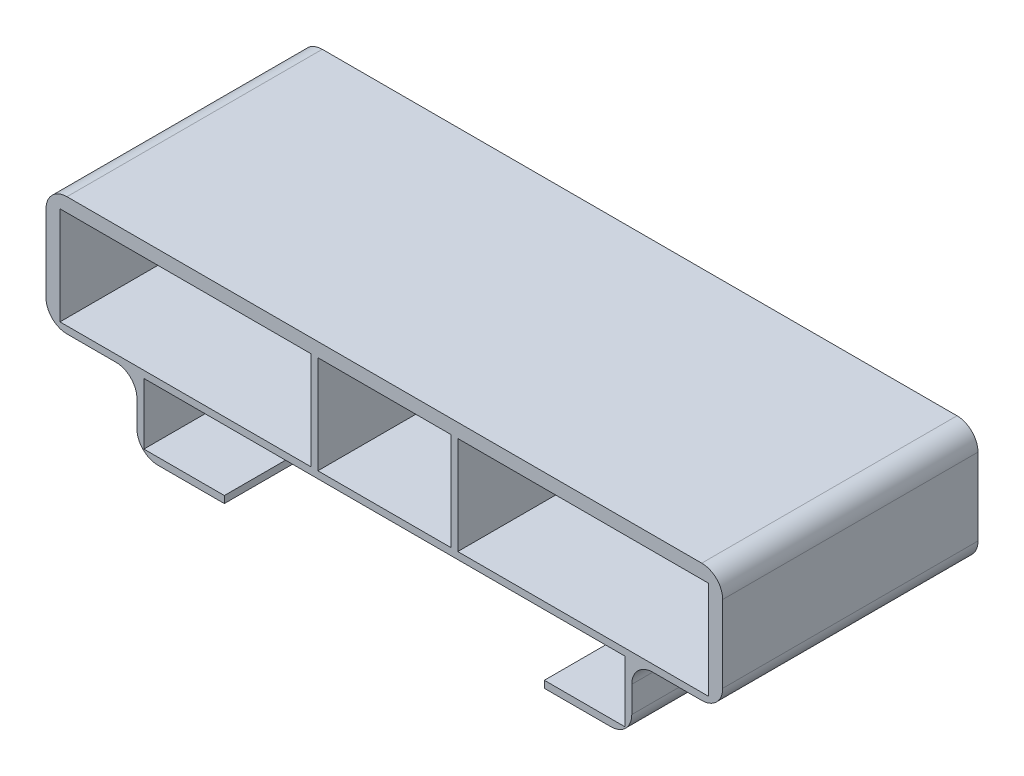
ISO-10303-21;
HEADER;
FILE_DESCRIPTION(('STEP AP214'),'2;1');
FILE_NAME('part.step','',(''),(''),'','','');
FILE_SCHEMA(('AUTOMOTIVE_DESIGN { 1 0 10303 214 1 1 1 1 }'));
ENDSEC;
DATA;
#1=APPLICATION_CONTEXT('core data for automotive mechanical design processes');
#2=APPLICATION_PROTOCOL_DEFINITION('international standard','automotive_design',2000,#1);
#3=PRODUCT_CONTEXT('',#1,'mechanical');
#4=PRODUCT('Part','Part','',(#3));
#5=PRODUCT_RELATED_PRODUCT_CATEGORY('part','',(#4));
#6=PRODUCT_DEFINITION_FORMATION('','',#4);
#7=PRODUCT_DEFINITION_CONTEXT('part definition',#1,'design');
#8=PRODUCT_DEFINITION('design','',#6,#7);
#9=PRODUCT_DEFINITION_SHAPE('','',#8);
#10=(LENGTH_UNIT() NAMED_UNIT(*) SI_UNIT(.MILLI.,.METRE.));
#11=(NAMED_UNIT(*) PLANE_ANGLE_UNIT() SI_UNIT($,.RADIAN.));
#12=(NAMED_UNIT(*) SI_UNIT($,.STERADIAN.) SOLID_ANGLE_UNIT());
#13=UNCERTAINTY_MEASURE_WITH_UNIT(LENGTH_MEASURE(1.E-05),#10,'distance_accuracy_value','');
#14=(GEOMETRIC_REPRESENTATION_CONTEXT(3) GLOBAL_UNCERTAINTY_ASSIGNED_CONTEXT((#13)) GLOBAL_UNIT_ASSIGNED_CONTEXT((#10,
#11,#12)) REPRESENTATION_CONTEXT('',''));
#15=CARTESIAN_POINT('',(0.,0.,0.));
#16=DIRECTION('',(0.,0.,1.));
#17=DIRECTION('',(1.,0.,0.));
#18=AXIS2_PLACEMENT_3D('',#15,#16,#17);
#19=CARTESIAN_POINT('',(0.,0.,73.));
#20=DIRECTION('',(0.,-1.,0.));
#21=DIRECTION('',(0.,0.,-1.));
#22=AXIS2_PLACEMENT_3D('',#19,#20,#21);
#23=PLANE('',#22);
#24=DIRECTION('',(1.,0.,0.));
#25=VECTOR('',#24,1.);
#26=CARTESIAN_POINT('',(51.75,0.,2.));
#27=LINE('',#26,#25);
#28=CARTESIAN_POINT('',(51.75,0.,2.));
#29=VERTEX_POINT('',#28);
#30=CARTESIAN_POINT('',(89.75,0.,2.));
#31=VERTEX_POINT('',#30);
#32=EDGE_CURVE('E309',#29,#31,#27,.T.);
#33=ORIENTED_EDGE('',*,*,#32,.F.);
#34=DIRECTION('',(0.,0.,-1.));
#35=VECTOR('',#34,1.);
#36=CARTESIAN_POINT('',(51.75,0.,0.));
#37=LINE('',#36,#35);
#38=CARTESIAN_POINT('',(51.75,0.,73.));
#39=VERTEX_POINT('',#38);
#40=EDGE_CURVE('E337',#39,#29,#37,.T.);
#41=ORIENTED_EDGE('',*,*,#40,.F.);
#42=DIRECTION('',(-1.,0.,0.));
#43=VECTOR('',#42,1.);
#44=CARTESIAN_POINT('',(0.,0.,73.));
#45=LINE('',#44,#43);
#46=CARTESIAN_POINT('',(89.75,0.,73.));
#47=VERTEX_POINT('',#46);
#48=EDGE_CURVE('E542',#47,#39,#45,.T.);
#49=ORIENTED_EDGE('',*,*,#48,.F.);
#50=DIRECTION('',(0.,0.,1.));
#51=VECTOR('',#50,1.);
#52=CARTESIAN_POINT('',(89.75,0.,0.));
#53=LINE('',#52,#51);
#54=EDGE_CURVE('E326',#31,#47,#53,.T.);
#55=ORIENTED_EDGE('',*,*,#54,.F.);
#56=EDGE_LOOP('',(#33,#41,#49,#55));
#57=FACE_BOUND('',#56,.T.);
#58=ADVANCED_FACE('F44',(#57),#23,.F.);
#59=CARTESIAN_POINT('',(0.,28.,0.));
#60=DIRECTION('',(0.,1.,0.));
#61=DIRECTION('',(0.,0.,1.));
#62=AXIS2_PLACEMENT_3D('',#59,#60,#61);
#63=PLANE('',#62);
#64=DIRECTION('',(1.,0.,0.));
#65=VECTOR('',#64,1.);
#66=CARTESIAN_POINT('',(51.75,28.,2.));
#67=LINE('',#66,#65);
#68=CARTESIAN_POINT('',(51.75,28.,2.));
#69=VERTEX_POINT('',#68);
#70=CARTESIAN_POINT('',(89.75,28.,2.));
#71=VERTEX_POINT('',#70);
#72=EDGE_CURVE('E300',#69,#71,#67,.T.);
#73=ORIENTED_EDGE('',*,*,#72,.T.);
#74=DIRECTION('',(0.,0.,1.));
#75=VECTOR('',#74,1.);
#76=CARTESIAN_POINT('',(89.75,28.,0.));
#77=LINE('',#76,#75);
#78=CARTESIAN_POINT('',(89.75,28.,73.));
#79=VERTEX_POINT('',#78);
#80=EDGE_CURVE('E283',#71,#79,#77,.T.);
#81=ORIENTED_EDGE('',*,*,#80,.T.);
#82=DIRECTION('',(1.,0.,0.));
#83=VECTOR('',#82,1.);
#84=CARTESIAN_POINT('',(-26.,28.,73.));
#85=LINE('',#84,#83);
#86=CARTESIAN_POINT('',(51.75,28.,73.));
#87=VERTEX_POINT('',#86);
#88=EDGE_CURVE('E378',#87,#79,#85,.T.);
#89=ORIENTED_EDGE('',*,*,#88,.F.);
#90=DIRECTION('',(0.,0.,-1.));
#91=VECTOR('',#90,1.);
#92=CARTESIAN_POINT('',(51.75,28.,0.));
#93=LINE('',#92,#91);
#94=EDGE_CURVE('E302',#87,#69,#93,.T.);
#95=ORIENTED_EDGE('',*,*,#94,.T.);
#96=EDGE_LOOP('',(#73,#81,#89,#95));
#97=FACE_BOUND('',#96,.T.);
#98=ADVANCED_FACE('F301',(#97),#63,.F.);
#99=CARTESIAN_POINT('',(51.75,101.027392121039,0.));
#100=DIRECTION('',(-1.,0.,0.));
#101=DIRECTION('',(0.,0.,1.));
#102=AXIS2_PLACEMENT_3D('',#99,#100,#101);
#103=PLANE('',#102);
#104=DIRECTION('',(0.,-1.,0.));
#105=VECTOR('',#104,1.);
#106=CARTESIAN_POINT('',(51.75,66.0525951808809,2.));
#107=LINE('',#106,#105);
#108=EDGE_CURVE('E313',#69,#29,#107,.T.);
#109=ORIENTED_EDGE('',*,*,#108,.F.);
#110=ORIENTED_EDGE('',*,*,#94,.F.);
#111=DIRECTION('',(0.,-1.,0.));
#112=VECTOR('',#111,1.);
#113=CARTESIAN_POINT('',(51.75,101.027392121039,73.));
#114=LINE('',#113,#112);
#115=EDGE_CURVE('E342',#87,#39,#114,.T.);
#116=ORIENTED_EDGE('',*,*,#115,.T.);
#117=ORIENTED_EDGE('',*,*,#40,.T.);
#118=EDGE_LOOP('',(#109,#110,#116,#117));
#119=FACE_BOUND('',#118,.T.);
#120=ADVANCED_FACE('F789',(#119),#103,.F.);
#121=CARTESIAN_POINT('',(89.75,101.027392121039,0.));
#122=DIRECTION('',(1.,0.,0.));
#123=DIRECTION('',(0.,0.,-1.));
#124=AXIS2_PLACEMENT_3D('',#121,#122,#123);
#125=PLANE('',#124);
#126=DIRECTION('',(0.,-1.,0.));
#127=VECTOR('',#126,1.);
#128=CARTESIAN_POINT('',(89.75,66.0525951808809,2.));
#129=LINE('',#128,#127);
#130=EDGE_CURVE('E287',#71,#31,#129,.T.);
#131=ORIENTED_EDGE('',*,*,#130,.T.);
#132=ORIENTED_EDGE('',*,*,#54,.T.);
#133=DIRECTION('',(0.,-1.,0.));
#134=VECTOR('',#133,1.);
#135=CARTESIAN_POINT('',(89.75,101.027392121039,73.));
#136=LINE('',#135,#134);
#137=EDGE_CURVE('E290',#79,#47,#136,.T.);
#138=ORIENTED_EDGE('',*,*,#137,.F.);
#139=ORIENTED_EDGE('',*,*,#80,.F.);
#140=EDGE_LOOP('',(#131,#132,#138,#139));
#141=FACE_BOUND('',#140,.T.);
#142=ADVANCED_FACE('F285',(#141),#125,.F.);
#143=DIRECTION('',(0.,0.,-1.));
#144=VECTOR('',#143,1.);
#145=CARTESIAN_POINT('',(91.75,0.,0.));
#146=LINE('',#145,#144);
#147=CARTESIAN_POINT('',(91.75,0.,73.));
#148=VERTEX_POINT('',#147);
#149=CARTESIAN_POINT('',(91.75,0.,0.));
#150=VERTEX_POINT('',#149);
#151=EDGE_CURVE('E320',#148,#150,#146,.T.);
#152=ORIENTED_EDGE('',*,*,#151,.F.);
#153=CARTESIAN_POINT('',(163.5,0.,73.));
#154=VERTEX_POINT('',#153);
#155=EDGE_CURVE('E537',#154,#148,#45,.T.);
#156=ORIENTED_EDGE('',*,*,#155,.F.);
#157=DIRECTION('',(0.,0.,1.));
#158=VECTOR('',#157,1.);
#159=CARTESIAN_POINT('',(163.5,0.,0.));
#160=LINE('',#159,#158);
#161=CARTESIAN_POINT('',(163.5,0.,0.));
#162=VERTEX_POINT('',#161);
#163=EDGE_CURVE('E394',#162,#154,#160,.T.);
#164=ORIENTED_EDGE('',*,*,#163,.F.);
#165=DIRECTION('',(-1.,0.,0.));
#166=VECTOR('',#165,1.);
#167=CARTESIAN_POINT('',(0.,0.,0.));
#168=LINE('',#167,#166);
#169=EDGE_CURVE('E529',#162,#150,#168,.T.);
#170=ORIENTED_EDGE('',*,*,#169,.T.);
#171=EDGE_LOOP('',(#152,#156,#164,#170));
#172=FACE_BOUND('',#171,.T.);
#173=ADVANCED_FACE('F767',(#172),#23,.F.);
#174=DIRECTION('',(0.,0.,-1.));
#175=VECTOR('',#174,1.);
#176=CARTESIAN_POINT('',(91.75,28.,0.));
#177=LINE('',#176,#175);
#178=CARTESIAN_POINT('',(91.75,28.,73.));
#179=VERTEX_POINT('',#178);
#180=CARTESIAN_POINT('',(91.75,28.,0.));
#181=VERTEX_POINT('',#180);
#182=EDGE_CURVE('E296',#179,#181,#177,.T.);
#183=ORIENTED_EDGE('',*,*,#182,.T.);
#184=DIRECTION('',(-1.,0.,0.));
#185=VECTOR('',#184,1.);
#186=CARTESIAN_POINT('',(-26.,28.,0.));
#187=LINE('',#186,#185);
#188=CARTESIAN_POINT('',(163.5,28.,0.));
#189=VERTEX_POINT('',#188);
#190=EDGE_CURVE('E368',#189,#181,#187,.T.);
#191=ORIENTED_EDGE('',*,*,#190,.F.);
#192=DIRECTION('',(0.,0.,1.));
#193=VECTOR('',#192,1.);
#194=CARTESIAN_POINT('',(163.5,28.,0.));
#195=LINE('',#194,#193);
#196=CARTESIAN_POINT('',(163.5,28.,73.));
#197=VERTEX_POINT('',#196);
#198=EDGE_CURVE('E398',#189,#197,#195,.T.);
#199=ORIENTED_EDGE('',*,*,#198,.T.);
#200=EDGE_CURVE('E350',#179,#197,#85,.T.);
#201=ORIENTED_EDGE('',*,*,#200,.F.);
#202=EDGE_LOOP('',(#183,#191,#199,#201));
#203=FACE_BOUND('',#202,.T.);
#204=ADVANCED_FACE('F763',(#203),#63,.F.);
#205=DIRECTION('',(0.,0.,1.));
#206=VECTOR('',#205,1.);
#207=CARTESIAN_POINT('',(49.75,0.,0.));
#208=LINE('',#207,#206);
#209=CARTESIAN_POINT('',(49.75,0.,0.));
#210=VERTEX_POINT('',#209);
#211=CARTESIAN_POINT('',(49.75,0.,73.));
#212=VERTEX_POINT('',#211);
#213=EDGE_CURVE('E343',#210,#212,#208,.T.);
#214=ORIENTED_EDGE('',*,*,#213,.F.);
#215=CARTESIAN_POINT('',(-22.,0.,0.));
#216=VERTEX_POINT('',#215);
#217=EDGE_CURVE('E554',#210,#216,#168,.T.);
#218=ORIENTED_EDGE('',*,*,#217,.T.);
#219=DIRECTION('',(0.,0.,-1.));
#220=VECTOR('',#219,1.);
#221=CARTESIAN_POINT('',(-22.,0.,0.));
#222=LINE('',#221,#220);
#223=CARTESIAN_POINT('',(-22.,0.,73.));
#224=VERTEX_POINT('',#223);
#225=EDGE_CURVE('E390',#224,#216,#222,.T.);
#226=ORIENTED_EDGE('',*,*,#225,.F.);
#227=EDGE_CURVE('E536',#212,#224,#45,.T.);
#228=ORIENTED_EDGE('',*,*,#227,.F.);
#229=EDGE_LOOP('',(#214,#218,#226,#228));
#230=FACE_BOUND('',#229,.T.);
#231=ADVANCED_FACE('F785',(#230),#23,.F.);
#232=DIRECTION('',(0.,0.,1.));
#233=VECTOR('',#232,1.);
#234=CARTESIAN_POINT('',(49.75,28.,0.));
#235=LINE('',#234,#233);
#236=CARTESIAN_POINT('',(49.75,28.,0.));
#237=VERTEX_POINT('',#236);
#238=CARTESIAN_POINT('',(49.75,28.,73.));
#239=VERTEX_POINT('',#238);
#240=EDGE_CURVE('E341',#237,#239,#235,.T.);
#241=ORIENTED_EDGE('',*,*,#240,.T.);
#242=CARTESIAN_POINT('',(-22.,28.,73.));
#243=VERTEX_POINT('',#242);
#244=EDGE_CURVE('E373',#243,#239,#85,.T.);
#245=ORIENTED_EDGE('',*,*,#244,.F.);
#246=DIRECTION('',(0.,0.,-1.));
#247=VECTOR('',#246,1.);
#248=CARTESIAN_POINT('',(-22.,28.,0.));
#249=LINE('',#248,#247);
#250=CARTESIAN_POINT('',(-22.,28.,0.));
#251=VERTEX_POINT('',#250);
#252=EDGE_CURVE('E389',#243,#251,#249,.T.);
#253=ORIENTED_EDGE('',*,*,#252,.T.);
#254=EDGE_CURVE('E377',#237,#251,#187,.T.);
#255=ORIENTED_EDGE('',*,*,#254,.F.);
#256=EDGE_LOOP('',(#241,#245,#253,#255));
#257=FACE_BOUND('',#256,.T.);
#258=ADVANCED_FACE('F791',(#257),#63,.F.);
#259=CARTESIAN_POINT('',(141.5,0.,73.));
#260=DIRECTION('',(-1.,0.,0.));
#261=DIRECTION('',(0.,0.,1.));
#262=AXIS2_PLACEMENT_3D('',#259,#260,#261);
#263=PLANE('',#262);
#264=DIRECTION('',(0.,1.,0.));
#265=VECTOR('',#264,1.);
#266=CARTESIAN_POINT('',(141.5,0.,73.));
#267=LINE('',#266,#265);
#268=CARTESIAN_POINT('',(141.5,-15.5,73.));
#269=VERTEX_POINT('',#268);
#270=CARTESIAN_POINT('',(141.5,-8.,73.));
#271=VERTEX_POINT('',#270);
#272=EDGE_CURVE('E533',#269,#271,#267,.T.);
#273=ORIENTED_EDGE('',*,*,#272,.F.);
#274=DIRECTION('',(0.,0.,-1.));
#275=VECTOR('',#274,1.);
#276=CARTESIAN_POINT('',(141.5,-15.5,73.));
#277=LINE('',#276,#275);
#278=CARTESIAN_POINT('',(141.5,-15.5,0.));
#279=VERTEX_POINT('',#278);
#280=EDGE_CURVE('E605',#269,#279,#277,.T.);
#281=ORIENTED_EDGE('',*,*,#280,.T.);
#282=DIRECTION('',(0.,1.,0.));
#283=VECTOR('',#282,1.);
#284=CARTESIAN_POINT('',(141.5,0.,0.));
#285=LINE('',#284,#283);
#286=CARTESIAN_POINT('',(141.5,-8.,0.));
#287=VERTEX_POINT('',#286);
#288=EDGE_CURVE('E550',#279,#287,#285,.T.);
#289=ORIENTED_EDGE('',*,*,#288,.T.);
#290=DIRECTION('',(0.,0.,-1.));
#291=VECTOR('',#290,1.);
#292=CARTESIAN_POINT('',(141.5,-8.,73.));
#293=LINE('',#292,#291);
#294=EDGE_CURVE('E602',#287,#271,#293,.F.);
#295=ORIENTED_EDGE('',*,*,#294,.T.);
#296=EDGE_LOOP('',(#273,#281,#289,#295));
#297=FACE_BOUND('',#296,.T.);
#298=ADVANCED_FACE('F662',(#297),#263,.F.);
#299=CARTESIAN_POINT('',(0.,0.,73.));
#300=DIRECTION('',(1.,0.,0.));
#301=DIRECTION('',(0.,1.,0.));
#302=AXIS2_PLACEMENT_3D('',#299,#300,#301);
#303=PLANE('',#302);
#304=DIRECTION('',(0.,-1.,0.));
#305=VECTOR('',#304,1.);
#306=CARTESIAN_POINT('',(0.,0.,0.));
#307=LINE('',#306,#305);
#308=CARTESIAN_POINT('',(0.,-8.,0.));
#309=VERTEX_POINT('',#308);
#310=CARTESIAN_POINT('',(0.,-15.5,0.));
#311=VERTEX_POINT('',#310);
#312=EDGE_CURVE('E485',#309,#311,#307,.T.);
#313=ORIENTED_EDGE('',*,*,#312,.T.);
#314=DIRECTION('',(0.,0.,-1.));
#315=VECTOR('',#314,1.);
#316=CARTESIAN_POINT('',(0.,-15.5,73.));
#317=LINE('',#316,#315);
#318=CARTESIAN_POINT('',(0.,-15.5,73.));
#319=VERTEX_POINT('',#318);
#320=EDGE_CURVE('E581',#311,#319,#317,.F.);
#321=ORIENTED_EDGE('',*,*,#320,.T.);
#322=DIRECTION('',(0.,-1.,0.));
#323=VECTOR('',#322,1.);
#324=CARTESIAN_POINT('',(0.,0.,73.));
#325=LINE('',#324,#323);
#326=CARTESIAN_POINT('',(0.,-8.,73.));
#327=VERTEX_POINT('',#326);
#328=EDGE_CURVE('E524',#327,#319,#325,.T.);
#329=ORIENTED_EDGE('',*,*,#328,.F.);
#330=DIRECTION('',(0.,0.,1.));
#331=VECTOR('',#330,1.);
#332=CARTESIAN_POINT('',(0.,-8.,0.));
#333=LINE('',#332,#331);
#334=EDGE_CURVE('E578',#327,#309,#333,.F.);
#335=ORIENTED_EDGE('',*,*,#334,.T.);
#336=EDGE_LOOP('',(#313,#321,#329,#335));
#337=FACE_BOUND('',#336,.T.);
#338=ADVANCED_FACE('F710',(#337),#303,.F.);
#339=CARTESIAN_POINT('',(0.,-21.5,73.));
#340=DIRECTION('',(0.,1.,0.));
#341=DIRECTION('',(0.,0.,1.));
#342=AXIS2_PLACEMENT_3D('',#339,#340,#341);
#343=PLANE('',#342);
#344=DIRECTION('',(1.,0.,0.));
#345=VECTOR('',#344,1.);
#346=CARTESIAN_POINT('',(0.,-21.5,73.));
#347=LINE('',#346,#345);
#348=CARTESIAN_POINT('',(6.,-21.5,73.));
#349=VERTEX_POINT('',#348);
#350=CARTESIAN_POINT('',(25.,-21.5,73.));
#351=VERTEX_POINT('',#350);
#352=EDGE_CURVE('E530',#349,#351,#347,.T.);
#353=ORIENTED_EDGE('',*,*,#352,.F.);
#354=DIRECTION('',(0.,0.,-1.));
#355=VECTOR('',#354,1.);
#356=CARTESIAN_POINT('',(6.,-21.5,73.));
#357=LINE('',#356,#355);
#358=CARTESIAN_POINT('',(6.,-21.5,0.));
#359=VERTEX_POINT('',#358);
#360=EDGE_CURVE('E541',#349,#359,#357,.T.);
#361=ORIENTED_EDGE('',*,*,#360,.T.);
#362=DIRECTION('',(1.,0.,0.));
#363=VECTOR('',#362,1.);
#364=CARTESIAN_POINT('',(0.,-21.5,0.));
#365=LINE('',#364,#363);
#366=CARTESIAN_POINT('',(25.,-21.5,0.));
#367=VERTEX_POINT('',#366);
#368=EDGE_CURVE('E547',#359,#367,#365,.T.);
#369=ORIENTED_EDGE('',*,*,#368,.T.);
#370=DIRECTION('',(0.,0.,1.));
#371=VECTOR('',#370,1.);
#372=CARTESIAN_POINT('',(25.,-21.5,-91.5218553133622));
#373=LINE('',#372,#371);
#374=EDGE_CURVE('E462',#367,#351,#373,.T.);
#375=ORIENTED_EDGE('',*,*,#374,.T.);
#376=EDGE_LOOP('',(#353,#361,#369,#375));
#377=FACE_BOUND('',#376,.T.);
#378=ADVANCED_FACE('F719',(#377),#343,.F.);
#379=CARTESIAN_POINT('',(0.,-19.5,73.));
#380=DIRECTION('',(0.,1.,0.));
#381=DIRECTION('',(0.,0.,1.));
#382=AXIS2_PLACEMENT_3D('',#379,#380,#381);
#383=PLANE('',#382);
#384=DIRECTION('',(0.,0.,1.));
#385=VECTOR('',#384,1.);
#386=CARTESIAN_POINT('',(25.,-19.5,-91.5218553133622));
#387=LINE('',#386,#385);
#388=CARTESIAN_POINT('',(25.,-19.5,2.));
#389=VERTEX_POINT('',#388);
#390=CARTESIAN_POINT('',(25.,-19.5,73.));
#391=VERTEX_POINT('',#390);
#392=EDGE_CURVE('E466',#389,#391,#387,.T.);
#393=ORIENTED_EDGE('',*,*,#392,.F.);
#394=DIRECTION('',(1.,0.,0.));
#395=VECTOR('',#394,1.);
#396=CARTESIAN_POINT('',(0.,-19.5,2.));
#397=LINE('',#396,#395);
#398=CARTESIAN_POINT('',(2.,-19.5,2.));
#399=VERTEX_POINT('',#398);
#400=EDGE_CURVE('E493',#399,#389,#397,.T.);
#401=ORIENTED_EDGE('',*,*,#400,.F.);
#402=DIRECTION('',(0.,0.,-1.));
#403=VECTOR('',#402,1.);
#404=CARTESIAN_POINT('',(2.,-19.5,73.));
#405=LINE('',#404,#403);
#406=CARTESIAN_POINT('',(2.,-19.5,73.));
#407=VERTEX_POINT('',#406);
#408=EDGE_CURVE('E481',#407,#399,#405,.T.);
#409=ORIENTED_EDGE('',*,*,#408,.F.);
#410=DIRECTION('',(1.,0.,0.));
#411=VECTOR('',#410,1.);
#412=CARTESIAN_POINT('',(0.,-19.5,73.));
#413=LINE('',#412,#411);
#414=EDGE_CURVE('E514',#407,#391,#413,.T.);
#415=ORIENTED_EDGE('',*,*,#414,.T.);
#416=EDGE_LOOP('',(#393,#401,#409,#415));
#417=FACE_BOUND('',#416,.T.);
#418=ADVANCED_FACE('F851',(#417),#383,.T.);
#419=CARTESIAN_POINT('',(116.5,-21.5,0.));
#420=VERTEX_POINT('',#419);
#421=CARTESIAN_POINT('',(135.5,-21.5,0.));
#422=VERTEX_POINT('',#421);
#423=EDGE_CURVE('E546',#420,#422,#365,.T.);
#424=ORIENTED_EDGE('',*,*,#423,.T.);
#425=DIRECTION('',(0.,0.,-1.));
#426=VECTOR('',#425,1.);
#427=CARTESIAN_POINT('',(135.5,-21.5,73.));
#428=LINE('',#427,#426);
#429=CARTESIAN_POINT('',(135.5,-21.5,73.));
#430=VERTEX_POINT('',#429);
#431=EDGE_CURVE('E609',#422,#430,#428,.F.);
#432=ORIENTED_EDGE('',*,*,#431,.T.);
#433=CARTESIAN_POINT('',(116.5,-21.5,73.));
#434=VERTEX_POINT('',#433);
#435=EDGE_CURVE('E528',#434,#430,#347,.T.);
#436=ORIENTED_EDGE('',*,*,#435,.F.);
#437=DIRECTION('',(0.,0.,1.));
#438=VECTOR('',#437,1.);
#439=CARTESIAN_POINT('',(116.5,-21.5,-91.5218553133622));
#440=LINE('',#439,#438);
#441=EDGE_CURVE('E471',#420,#434,#440,.T.);
#442=ORIENTED_EDGE('',*,*,#441,.F.);
#443=EDGE_LOOP('',(#424,#432,#436,#442));
#444=FACE_BOUND('',#443,.T.);
#445=ADVANCED_FACE('F862',(#444),#343,.F.);
#446=CARTESIAN_POINT('',(0.,0.,73.));
#447=DIRECTION('',(0.,0.,1.));
#448=DIRECTION('',(1.,0.,0.));
#449=AXIS2_PLACEMENT_3D('',#446,#447,#448);
#450=PLANE('',#449);
#451=ORIENTED_EDGE('',*,*,#155,.T.);
#452=DIRECTION('',(0.,-1.,0.));
#453=VECTOR('',#452,1.);
#454=CARTESIAN_POINT('',(91.75,101.027392121039,73.));
#455=LINE('',#454,#453);
#456=EDGE_CURVE('E321',#179,#148,#455,.T.);
#457=ORIENTED_EDGE('',*,*,#456,.F.);
#458=ORIENTED_EDGE('',*,*,#200,.T.);
#459=DIRECTION('',(0.,-1.,0.));
#460=VECTOR('',#459,1.);
#461=CARTESIAN_POINT('',(163.5,28.,73.));
#462=LINE('',#461,#460);
#463=EDGE_CURVE('E402',#197,#154,#462,.T.);
#464=ORIENTED_EDGE('',*,*,#463,.T.);
#465=EDGE_LOOP('',(#451,#457,#458,#464));
#466=FACE_BOUND('',#465,.T.);
#467=ORIENTED_EDGE('',*,*,#137,.T.);
#468=ORIENTED_EDGE('',*,*,#48,.T.);
#469=ORIENTED_EDGE('',*,*,#115,.F.);
#470=ORIENTED_EDGE('',*,*,#88,.T.);
#471=EDGE_LOOP('',(#467,#468,#469,#470));
#472=FACE_BOUND('',#471,.T.);
#473=ORIENTED_EDGE('',*,*,#328,.T.);
#474=CARTESIAN_POINT('',(6.,-15.5,73.));
#475=DIRECTION('',(0.,0.,1.));
#476=DIRECTION('',(1.,0.,0.));
#477=AXIS2_PLACEMENT_3D('',#474,#475,#476);
#478=CIRCLE('',#477,6.);
#479=EDGE_CURVE('E599',#319,#349,#478,.T.);
#480=ORIENTED_EDGE('',*,*,#479,.T.);
#481=ORIENTED_EDGE('',*,*,#352,.T.);
#482=DIRECTION('',(0.,-1.,0.));
#483=VECTOR('',#482,1.);
#484=CARTESIAN_POINT('',(25.,-19.5,73.));
#485=LINE('',#484,#483);
#486=EDGE_CURVE('E444',#391,#351,#485,.T.);
#487=ORIENTED_EDGE('',*,*,#486,.F.);
#488=ORIENTED_EDGE('',*,*,#414,.F.);
#489=DIRECTION('',(0.,-1.,0.));
#490=VECTOR('',#489,1.);
#491=CARTESIAN_POINT('',(2.,0.,73.));
#492=LINE('',#491,#490);
#493=CARTESIAN_POINT('',(2.,-2.,73.));
#494=VERTEX_POINT('',#493);
#495=EDGE_CURVE('E510',#494,#407,#492,.T.);
#496=ORIENTED_EDGE('',*,*,#495,.F.);
#497=DIRECTION('',(-1.,0.,0.));
#498=VECTOR('',#497,1.);
#499=CARTESIAN_POINT('',(0.,-2.,73.));
#500=LINE('',#499,#498);
#501=CARTESIAN_POINT('',(139.5,-2.,73.));
#502=VERTEX_POINT('',#501);
#503=EDGE_CURVE('E492',#502,#494,#500,.T.);
#504=ORIENTED_EDGE('',*,*,#503,.F.);
#505=DIRECTION('',(0.,1.,0.));
#506=VECTOR('',#505,1.);
#507=CARTESIAN_POINT('',(139.5,0.,73.));
#508=LINE('',#507,#506);
#509=CARTESIAN_POINT('',(139.5,-19.5,73.));
#510=VERTEX_POINT('',#509);
#511=EDGE_CURVE('E518',#510,#502,#508,.T.);
#512=ORIENTED_EDGE('',*,*,#511,.F.);
#513=CARTESIAN_POINT('',(116.5,-19.5,73.));
#514=VERTEX_POINT('',#513);
#515=EDGE_CURVE('E513',#514,#510,#413,.T.);
#516=ORIENTED_EDGE('',*,*,#515,.F.);
#517=DIRECTION('',(0.,1.,0.));
#518=VECTOR('',#517,1.);
#519=CARTESIAN_POINT('',(116.5,-19.5,73.));
#520=LINE('',#519,#518);
#521=EDGE_CURVE('E459',#434,#514,#520,.T.);
#522=ORIENTED_EDGE('',*,*,#521,.F.);
#523=ORIENTED_EDGE('',*,*,#435,.T.);
#524=CARTESIAN_POINT('',(135.5,-15.5,73.));
#525=DIRECTION('',(0.,0.,1.));
#526=DIRECTION('',(1.,0.,0.));
#527=AXIS2_PLACEMENT_3D('',#524,#525,#526);
#528=CIRCLE('',#527,6.);
#529=EDGE_CURVE('E596',#430,#269,#528,.T.);
#530=ORIENTED_EDGE('',*,*,#529,.T.);
#531=ORIENTED_EDGE('',*,*,#272,.T.);
#532=CARTESIAN_POINT('',(147.5,-8.,73.));
#533=DIRECTION('',(0.,0.,1.));
#534=DIRECTION('',(1.,0.,0.));
#535=AXIS2_PLACEMENT_3D('',#532,#533,#534);
#536=CIRCLE('',#535,6.);
#537=CARTESIAN_POINT('',(147.5,-2.,73.));
#538=VERTEX_POINT('',#537);
#539=EDGE_CURVE('E11',#271,#538,#536,.F.);
#540=ORIENTED_EDGE('',*,*,#539,.T.);
#541=DIRECTION('',(-1.,0.,0.));
#542=VECTOR('',#541,1.);
#543=CARTESIAN_POINT('',(167.5,-2.,73.));
#544=LINE('',#543,#542);
#545=CARTESIAN_POINT('',(161.5,-2.,73.));
#546=VERTEX_POINT('',#545);
#547=EDGE_CURVE('E425',#546,#538,#544,.T.);
#548=ORIENTED_EDGE('',*,*,#547,.F.);
#549=CARTESIAN_POINT('',(161.5,4.,73.));
#550=DIRECTION('',(0.,0.,1.));
#551=DIRECTION('',(1.,0.,0.));
#552=AXIS2_PLACEMENT_3D('',#549,#550,#551);
#553=CIRCLE('',#552,6.);
#554=CARTESIAN_POINT('',(167.5,4.,73.));
#555=VERTEX_POINT('',#554);
#556=EDGE_CURVE('E590',#546,#555,#553,.T.);
#557=ORIENTED_EDGE('',*,*,#556,.T.);
#558=DIRECTION('',(0.,-1.,0.));
#559=VECTOR('',#558,1.);
#560=CARTESIAN_POINT('',(167.5,0.,73.));
#561=LINE('',#560,#559);
#562=CARTESIAN_POINT('',(167.5,26.,73.));
#563=VERTEX_POINT('',#562);
#564=EDGE_CURVE('E413',#563,#555,#561,.T.);
#565=ORIENTED_EDGE('',*,*,#564,.F.);
#566=CARTESIAN_POINT('',(161.5,26.,73.));
#567=DIRECTION('',(0.,0.,1.));
#568=DIRECTION('',(1.,0.,0.));
#569=AXIS2_PLACEMENT_3D('',#566,#567,#568);
#570=CIRCLE('',#569,6.);
#571=CARTESIAN_POINT('',(161.5,32.,73.));
#572=VERTEX_POINT('',#571);
#573=EDGE_CURVE('E593',#563,#572,#570,.T.);
#574=ORIENTED_EDGE('',*,*,#573,.T.);
#575=DIRECTION('',(1.,0.,0.));
#576=VECTOR('',#575,1.);
#577=CARTESIAN_POINT('',(-26.,32.,73.));
#578=LINE('',#577,#576);
#579=CARTESIAN_POINT('',(-20.,32.,73.));
#580=VERTEX_POINT('',#579);
#581=EDGE_CURVE('E363',#580,#572,#578,.T.);
#582=ORIENTED_EDGE('',*,*,#581,.F.);
#583=CARTESIAN_POINT('',(-20.,26.,73.));
#584=DIRECTION('',(0.,0.,1.));
#585=DIRECTION('',(1.,0.,0.));
#586=AXIS2_PLACEMENT_3D('',#583,#584,#585);
#587=CIRCLE('',#586,6.);
#588=CARTESIAN_POINT('',(-26.,26.,73.));
#589=VERTEX_POINT('',#588);
#590=EDGE_CURVE('E587',#580,#589,#587,.T.);
#591=ORIENTED_EDGE('',*,*,#590,.T.);
#592=DIRECTION('',(0.,1.,0.));
#593=VECTOR('',#592,1.);
#594=CARTESIAN_POINT('',(-26.,0.,73.));
#595=LINE('',#594,#593);
#596=CARTESIAN_POINT('',(-26.,4.,73.));
#597=VERTEX_POINT('',#596);
#598=EDGE_CURVE('E432',#597,#589,#595,.T.);
#599=ORIENTED_EDGE('',*,*,#598,.F.);
#600=CARTESIAN_POINT('',(-20.,4.,73.));
#601=DIRECTION('',(0.,0.,1.));
#602=DIRECTION('',(1.,0.,0.));
#603=AXIS2_PLACEMENT_3D('',#600,#601,#602);
#604=CIRCLE('',#603,6.);
#605=CARTESIAN_POINT('',(-20.,-2.,73.));
#606=VERTEX_POINT('',#605);
#607=EDGE_CURVE('E584',#597,#606,#604,.T.);
#608=ORIENTED_EDGE('',*,*,#607,.T.);
#609=DIRECTION('',(1.,0.,0.));
#610=VECTOR('',#609,1.);
#611=CARTESIAN_POINT('',(-26.,-2.,73.));
#612=LINE('',#611,#610);
#613=CARTESIAN_POINT('',(-6.00000000000001,-2.,73.));
#614=VERTEX_POINT('',#613);
#615=EDGE_CURVE('E436',#606,#614,#612,.T.);
#616=ORIENTED_EDGE('',*,*,#615,.T.);
#617=CARTESIAN_POINT('',(-6.,-8.,73.));
#618=DIRECTION('',(0.,0.,1.));
#619=DIRECTION('',(1.,0.,0.));
#620=AXIS2_PLACEMENT_3D('',#617,#618,#619);
#621=CIRCLE('',#620,6.);
#622=EDGE_CURVE('E647',#614,#327,#621,.F.);
#623=ORIENTED_EDGE('',*,*,#622,.T.);
#624=EDGE_LOOP('',(#473,#480,#481,#487,#488,#496,#504,#512,#516,#522,#523,#530,#531,#540,#548,
#557,#565,#574,#582,#591,#599,#608,#616,#623));
#625=FACE_BOUND('',#624,.T.);
#626=ORIENTED_EDGE('',*,*,#244,.T.);
#627=DIRECTION('',(0.,-1.,0.));
#628=VECTOR('',#627,1.);
#629=CARTESIAN_POINT('',(49.75,101.027392121039,73.));
#630=LINE('',#629,#628);
#631=EDGE_CURVE('E347',#239,#212,#630,.T.);
#632=ORIENTED_EDGE('',*,*,#631,.T.);
#633=ORIENTED_EDGE('',*,*,#227,.T.);
#634=DIRECTION('',(0.,-1.,0.));
#635=VECTOR('',#634,1.);
#636=CARTESIAN_POINT('',(-22.,28.,73.));
#637=LINE('',#636,#635);
#638=EDGE_CURVE('E372',#243,#224,#637,.T.);
#639=ORIENTED_EDGE('',*,*,#638,.F.);
#640=EDGE_LOOP('',(#626,#632,#633,#639));
#641=FACE_BOUND('',#640,.T.);
#642=ADVANCED_FACE('F666',(#466,#472,#625,#641),#450,.T.);
#643=CARTESIAN_POINT('',(0.,0.,0.));
#644=DIRECTION('',(0.,0.,1.));
#645=DIRECTION('',(1.,0.,0.));
#646=AXIS2_PLACEMENT_3D('',#643,#644,#645);
#647=PLANE('',#646);
#648=ORIENTED_EDGE('',*,*,#217,.F.);
#649=DIRECTION('',(0.,-1.,0.));
#650=VECTOR('',#649,1.);
#651=CARTESIAN_POINT('',(49.75,101.027392121039,0.));
#652=LINE('',#651,#650);
#653=EDGE_CURVE('E333',#237,#210,#652,.T.);
#654=ORIENTED_EDGE('',*,*,#653,.F.);
#655=ORIENTED_EDGE('',*,*,#254,.T.);
#656=DIRECTION('',(0.,-1.,0.));
#657=VECTOR('',#656,1.);
#658=CARTESIAN_POINT('',(-22.,28.,0.));
#659=LINE('',#658,#657);
#660=EDGE_CURVE('E385',#251,#216,#659,.T.);
#661=ORIENTED_EDGE('',*,*,#660,.T.);
#662=EDGE_LOOP('',(#648,#654,#655,#661));
#663=FACE_BOUND('',#662,.T.);
#664=DIRECTION('',(0.,-1.,0.));
#665=VECTOR('',#664,1.);
#666=CARTESIAN_POINT('',(163.5,28.,0.));
#667=LINE('',#666,#665);
#668=EDGE_CURVE('E409',#189,#162,#667,.T.);
#669=ORIENTED_EDGE('',*,*,#668,.F.);
#670=ORIENTED_EDGE('',*,*,#190,.T.);
#671=DIRECTION('',(0.,-1.,0.));
#672=VECTOR('',#671,1.);
#673=CARTESIAN_POINT('',(91.75,101.027392121039,0.));
#674=LINE('',#673,#672);
#675=EDGE_CURVE('E295',#181,#150,#674,.T.);
#676=ORIENTED_EDGE('',*,*,#675,.T.);
#677=ORIENTED_EDGE('',*,*,#169,.F.);
#678=EDGE_LOOP('',(#669,#670,#676,#677));
#679=FACE_BOUND('',#678,.T.);
#680=ORIENTED_EDGE('',*,*,#368,.F.);
#681=CARTESIAN_POINT('',(6.,-15.5,0.));
#682=DIRECTION('',(0.,0.,1.));
#683=DIRECTION('',(1.,0.,0.));
#684=AXIS2_PLACEMENT_3D('',#681,#682,#683);
#685=CIRCLE('',#684,6.);
#686=EDGE_CURVE('E575',#359,#311,#685,.F.);
#687=ORIENTED_EDGE('',*,*,#686,.T.);
#688=ORIENTED_EDGE('',*,*,#312,.F.);
#689=CARTESIAN_POINT('',(-6.,-8.,0.));
#690=DIRECTION('',(0.,0.,1.));
#691=DIRECTION('',(1.,0.,0.));
#692=AXIS2_PLACEMENT_3D('',#689,#690,#691);
#693=CIRCLE('',#692,6.);
#694=CARTESIAN_POINT('',(-6.00000000000001,-2.,0.));
#695=VERTEX_POINT('',#694);
#696=EDGE_CURVE('E650',#309,#695,#693,.T.);
#697=ORIENTED_EDGE('',*,*,#696,.T.);
#698=DIRECTION('',(1.,0.,0.));
#699=VECTOR('',#698,1.);
#700=CARTESIAN_POINT('',(-26.,-2.,0.));
#701=LINE('',#700,#699);
#702=CARTESIAN_POINT('',(-20.,-2.,0.));
#703=VERTEX_POINT('',#702);
#704=EDGE_CURVE('E440',#703,#695,#701,.T.);
#705=ORIENTED_EDGE('',*,*,#704,.F.);
#706=CARTESIAN_POINT('',(-20.,4.,0.));
#707=DIRECTION('',(0.,0.,1.));
#708=DIRECTION('',(1.,0.,0.));
#709=AXIS2_PLACEMENT_3D('',#706,#707,#708);
#710=CIRCLE('',#709,6.);
#711=CARTESIAN_POINT('',(-26.,4.,0.));
#712=VERTEX_POINT('',#711);
#713=EDGE_CURVE('E560',#703,#712,#710,.F.);
#714=ORIENTED_EDGE('',*,*,#713,.T.);
#715=DIRECTION('',(0.,-1.,0.));
#716=VECTOR('',#715,1.);
#717=CARTESIAN_POINT('',(-26.,0.,0.));
#718=LINE('',#717,#716);
#719=CARTESIAN_POINT('',(-26.,26.,0.));
#720=VERTEX_POINT('',#719);
#721=EDGE_CURVE('E428',#720,#712,#718,.T.);
#722=ORIENTED_EDGE('',*,*,#721,.F.);
#723=CARTESIAN_POINT('',(-20.,26.,0.));
#724=DIRECTION('',(0.,0.,1.));
#725=DIRECTION('',(1.,0.,0.));
#726=AXIS2_PLACEMENT_3D('',#723,#724,#725);
#727=CIRCLE('',#726,6.);
#728=CARTESIAN_POINT('',(-20.,32.,0.));
#729=VERTEX_POINT('',#728);
#730=EDGE_CURVE('E563',#720,#729,#727,.F.);
#731=ORIENTED_EDGE('',*,*,#730,.T.);
#732=DIRECTION('',(-1.,0.,0.));
#733=VECTOR('',#732,1.);
#734=CARTESIAN_POINT('',(-26.,32.,0.));
#735=LINE('',#734,#733);
#736=CARTESIAN_POINT('',(161.5,32.,0.));
#737=VERTEX_POINT('',#736);
#738=EDGE_CURVE('E367',#737,#729,#735,.T.);
#739=ORIENTED_EDGE('',*,*,#738,.F.);
#740=CARTESIAN_POINT('',(161.5,26.,0.));
#741=DIRECTION('',(0.,0.,1.));
#742=DIRECTION('',(1.,0.,0.));
#743=AXIS2_PLACEMENT_3D('',#740,#741,#742);
#744=CIRCLE('',#743,6.);
#745=CARTESIAN_POINT('',(167.5,26.,0.));
#746=VERTEX_POINT('',#745);
#747=EDGE_CURVE('E569',#737,#746,#744,.F.);
#748=ORIENTED_EDGE('',*,*,#747,.T.);
#749=DIRECTION('',(0.,1.,0.));
#750=VECTOR('',#749,1.);
#751=CARTESIAN_POINT('',(167.5,0.,0.));
#752=LINE('',#751,#750);
#753=CARTESIAN_POINT('',(167.5,4.,0.));
#754=VERTEX_POINT('',#753);
#755=EDGE_CURVE('E417',#754,#746,#752,.T.);
#756=ORIENTED_EDGE('',*,*,#755,.F.);
#757=CARTESIAN_POINT('',(161.5,4.,0.));
#758=DIRECTION('',(0.,0.,1.));
#759=DIRECTION('',(1.,0.,0.));
#760=AXIS2_PLACEMENT_3D('',#757,#758,#759);
#761=CIRCLE('',#760,6.);
#762=CARTESIAN_POINT('',(161.5,-2.,0.));
#763=VERTEX_POINT('',#762);
#764=EDGE_CURVE('E566',#754,#763,#761,.F.);
#765=ORIENTED_EDGE('',*,*,#764,.T.);
#766=DIRECTION('',(-1.,0.,0.));
#767=VECTOR('',#766,1.);
#768=CARTESIAN_POINT('',(167.5,-2.,0.));
#769=LINE('',#768,#767);
#770=CARTESIAN_POINT('',(147.5,-2.,0.));
#771=VERTEX_POINT('',#770);
#772=EDGE_CURVE('E421',#763,#771,#769,.T.);
#773=ORIENTED_EDGE('',*,*,#772,.T.);
#774=CARTESIAN_POINT('',(147.5,-8.,0.));
#775=DIRECTION('',(0.,0.,1.));
#776=DIRECTION('',(1.,0.,0.));
#777=AXIS2_PLACEMENT_3D('',#774,#775,#776);
#778=CIRCLE('',#777,6.);
#779=EDGE_CURVE('E53',#771,#287,#778,.T.);
#780=ORIENTED_EDGE('',*,*,#779,.T.);
#781=ORIENTED_EDGE('',*,*,#288,.F.);
#782=CARTESIAN_POINT('',(135.5,-15.5,0.));
#783=DIRECTION('',(0.,0.,1.));
#784=DIRECTION('',(1.,0.,0.));
#785=AXIS2_PLACEMENT_3D('',#782,#783,#784);
#786=CIRCLE('',#785,6.);
#787=EDGE_CURVE('E572',#279,#422,#786,.F.);
#788=ORIENTED_EDGE('',*,*,#787,.T.);
#789=ORIENTED_EDGE('',*,*,#423,.F.);
#790=DIRECTION('',(0.,-1.,0.));
#791=VECTOR('',#790,1.);
#792=CARTESIAN_POINT('',(116.5,-19.5,0.));
#793=LINE('',#792,#791);
#794=CARTESIAN_POINT('',(116.5,-19.5,0.));
#795=VERTEX_POINT('',#794);
#796=EDGE_CURVE('E445',#795,#420,#793,.T.);
#797=ORIENTED_EDGE('',*,*,#796,.F.);
#798=DIRECTION('',(1.,0.,0.));
#799=VECTOR('',#798,1.);
#800=CARTESIAN_POINT('',(25.,-19.5,0.));
#801=LINE('',#800,#799);
#802=CARTESIAN_POINT('',(25.,-19.5,0.));
#803=VERTEX_POINT('',#802);
#804=EDGE_CURVE('E448',#803,#795,#801,.T.);
#805=ORIENTED_EDGE('',*,*,#804,.F.);
#806=DIRECTION('',(0.,1.,0.));
#807=VECTOR('',#806,1.);
#808=CARTESIAN_POINT('',(25.,-19.5,0.));
#809=LINE('',#808,#807);
#810=EDGE_CURVE('E452',#367,#803,#809,.T.);
#811=ORIENTED_EDGE('',*,*,#810,.F.);
#812=EDGE_LOOP('',(#680,#687,#688,#697,#705,#714,#722,#731,#739,#748,#756,#765,#773,#780,#781,
#788,#789,#797,#805,#811));
#813=FACE_BOUND('',#812,.T.);
#814=ADVANCED_FACE('F656',(#663,#679,#813),#647,.F.);
#815=CARTESIAN_POINT('',(2.,0.,73.));
#816=DIRECTION('',(1.,0.,0.));
#817=DIRECTION('',(0.,1.,0.));
#818=AXIS2_PLACEMENT_3D('',#815,#816,#817);
#819=PLANE('',#818);
#820=DIRECTION('',(0.,-1.,0.));
#821=VECTOR('',#820,1.);
#822=CARTESIAN_POINT('',(2.,0.,2.));
#823=LINE('',#822,#821);
#824=CARTESIAN_POINT('',(2.,-2.,2.));
#825=VERTEX_POINT('',#824);
#826=EDGE_CURVE('E455',#825,#399,#823,.T.);
#827=ORIENTED_EDGE('',*,*,#826,.F.);
#828=DIRECTION('',(0.,0.,-1.));
#829=VECTOR('',#828,1.);
#830=CARTESIAN_POINT('',(2.,-2.,73.));
#831=LINE('',#830,#829);
#832=EDGE_CURVE('E487',#494,#825,#831,.T.);
#833=ORIENTED_EDGE('',*,*,#832,.F.);
#834=ORIENTED_EDGE('',*,*,#495,.T.);
#835=ORIENTED_EDGE('',*,*,#408,.T.);
#836=EDGE_LOOP('',(#827,#833,#834,#835));
#837=FACE_BOUND('',#836,.T.);
#838=ADVANCED_FACE('F844',(#837),#819,.T.);
#839=DIRECTION('',(0.,0.,1.));
#840=VECTOR('',#839,1.);
#841=CARTESIAN_POINT('',(116.5,-19.5,-91.5218553133622));
#842=LINE('',#841,#840);
#843=CARTESIAN_POINT('',(116.5,-19.5,2.));
#844=VERTEX_POINT('',#843);
#845=EDGE_CURVE('E470',#844,#514,#842,.T.);
#846=ORIENTED_EDGE('',*,*,#845,.T.);
#847=ORIENTED_EDGE('',*,*,#515,.T.);
#848=DIRECTION('',(0.,0.,-1.));
#849=VECTOR('',#848,1.);
#850=CARTESIAN_POINT('',(139.5,-19.5,73.));
#851=LINE('',#850,#849);
#852=CARTESIAN_POINT('',(139.5,-19.5,2.));
#853=VERTEX_POINT('',#852);
#854=EDGE_CURVE('E486',#510,#853,#851,.T.);
#855=ORIENTED_EDGE('',*,*,#854,.T.);
#856=EDGE_CURVE('E480',#844,#853,#397,.T.);
#857=ORIENTED_EDGE('',*,*,#856,.F.);
#858=EDGE_LOOP('',(#846,#847,#855,#857));
#859=FACE_BOUND('',#858,.T.);
#860=ADVANCED_FACE('F742',(#859),#383,.T.);
#861=CARTESIAN_POINT('',(139.5,0.,73.));
#862=DIRECTION('',(-1.,0.,0.));
#863=DIRECTION('',(0.,0.,1.));
#864=AXIS2_PLACEMENT_3D('',#861,#862,#863);
#865=PLANE('',#864);
#866=DIRECTION('',(0.,1.,0.));
#867=VECTOR('',#866,1.);
#868=CARTESIAN_POINT('',(139.5,0.,2.));
#869=LINE('',#868,#867);
#870=CARTESIAN_POINT('',(139.5,-2.,2.));
#871=VERTEX_POINT('',#870);
#872=EDGE_CURVE('E497',#853,#871,#869,.T.);
#873=ORIENTED_EDGE('',*,*,#872,.F.);
#874=ORIENTED_EDGE('',*,*,#854,.F.);
#875=ORIENTED_EDGE('',*,*,#511,.T.);
#876=DIRECTION('',(0.,0.,-1.));
#877=VECTOR('',#876,1.);
#878=CARTESIAN_POINT('',(139.5,-2.,73.));
#879=LINE('',#878,#877);
#880=EDGE_CURVE('E491',#502,#871,#879,.T.);
#881=ORIENTED_EDGE('',*,*,#880,.T.);
#882=EDGE_LOOP('',(#873,#874,#875,#881));
#883=FACE_BOUND('',#882,.T.);
#884=ADVANCED_FACE('F850',(#883),#865,.T.);
#885=CARTESIAN_POINT('',(0.,-2.,73.));
#886=DIRECTION('',(0.,-1.,0.));
#887=DIRECTION('',(0.,0.,-1.));
#888=AXIS2_PLACEMENT_3D('',#885,#886,#887);
#889=PLANE('',#888);
#890=DIRECTION('',(-1.,0.,0.));
#891=VECTOR('',#890,1.);
#892=CARTESIAN_POINT('',(0.,-2.,2.));
#893=LINE('',#892,#891);
#894=EDGE_CURVE('E504',#871,#825,#893,.T.);
#895=ORIENTED_EDGE('',*,*,#894,.F.);
#896=ORIENTED_EDGE('',*,*,#880,.F.);
#897=ORIENTED_EDGE('',*,*,#503,.T.);
#898=ORIENTED_EDGE('',*,*,#832,.T.);
#899=EDGE_LOOP('',(#895,#896,#897,#898));
#900=FACE_BOUND('',#899,.T.);
#901=ADVANCED_FACE('F854',(#900),#889,.T.);
#902=CARTESIAN_POINT('',(0.,0.,2.));
#903=DIRECTION('',(0.,0.,1.));
#904=DIRECTION('',(1.,0.,0.));
#905=AXIS2_PLACEMENT_3D('',#902,#903,#904);
#906=PLANE('',#905);
#907=ORIENTED_EDGE('',*,*,#826,.T.);
#908=ORIENTED_EDGE('',*,*,#400,.T.);
#909=EDGE_CURVE('E498',#389,#844,#397,.T.);
#910=ORIENTED_EDGE('',*,*,#909,.T.);
#911=ORIENTED_EDGE('',*,*,#856,.T.);
#912=ORIENTED_EDGE('',*,*,#872,.T.);
#913=ORIENTED_EDGE('',*,*,#894,.T.);
#914=EDGE_LOOP('',(#907,#908,#910,#911,#912,#913));
#915=FACE_BOUND('',#914,.T.);
#916=ADVANCED_FACE('F747',(#915),#906,.T.);
#917=CARTESIAN_POINT('',(25.,-19.5,-91.5218553133622));
#918=DIRECTION('',(-1.,0.,0.));
#919=DIRECTION('',(0.,0.,1.));
#920=AXIS2_PLACEMENT_3D('',#917,#918,#919);
#921=PLANE('',#920);
#922=ORIENTED_EDGE('',*,*,#810,.T.);
#923=EDGE_CURVE('E449',#803,#389,#387,.T.);
#924=ORIENTED_EDGE('',*,*,#923,.T.);
#925=ORIENTED_EDGE('',*,*,#392,.T.);
#926=ORIENTED_EDGE('',*,*,#486,.T.);
#927=ORIENTED_EDGE('',*,*,#374,.F.);
#928=EDGE_LOOP('',(#922,#924,#925,#926,#927));
#929=FACE_BOUND('',#928,.T.);
#930=ADVANCED_FACE('F723',(#929),#921,.F.);
#931=CARTESIAN_POINT('',(25.,-19.5,-91.5218553133622));
#932=DIRECTION('',(0.,1.,0.));
#933=DIRECTION('',(0.,0.,1.));
#934=AXIS2_PLACEMENT_3D('',#931,#932,#933);
#935=PLANE('',#934);
#936=ORIENTED_EDGE('',*,*,#909,.F.);
#937=ORIENTED_EDGE('',*,*,#923,.F.);
#938=ORIENTED_EDGE('',*,*,#804,.T.);
#939=EDGE_CURVE('E467',#795,#844,#842,.T.);
#940=ORIENTED_EDGE('',*,*,#939,.T.);
#941=EDGE_LOOP('',(#936,#937,#938,#940));
#942=FACE_BOUND('',#941,.T.);
#943=ADVANCED_FACE('F730',(#942),#935,.F.);
#944=CARTESIAN_POINT('',(116.5,-19.5,-91.5218553133622));
#945=DIRECTION('',(1.,0.,0.));
#946=DIRECTION('',(0.,0.,-1.));
#947=AXIS2_PLACEMENT_3D('',#944,#945,#946);
#948=PLANE('',#947);
#949=ORIENTED_EDGE('',*,*,#796,.T.);
#950=ORIENTED_EDGE('',*,*,#441,.T.);
#951=ORIENTED_EDGE('',*,*,#521,.T.);
#952=ORIENTED_EDGE('',*,*,#845,.F.);
#953=ORIENTED_EDGE('',*,*,#939,.F.);
#954=EDGE_LOOP('',(#949,#950,#951,#952,#953));
#955=FACE_BOUND('',#954,.T.);
#956=ADVANCED_FACE('F733',(#955),#948,.F.);
#957=CARTESIAN_POINT('',(-26.,-2.,0.));
#958=DIRECTION('',(0.,1.,0.));
#959=DIRECTION('',(-1.,0.,0.));
#960=AXIS2_PLACEMENT_3D('',#957,#958,#959);
#961=PLANE('',#960);
#962=ORIENTED_EDGE('',*,*,#615,.F.);
#963=DIRECTION('',(0.,0.,1.));
#964=VECTOR('',#963,1.);
#965=CARTESIAN_POINT('',(-20.,-2.,0.));
#966=LINE('',#965,#964);
#967=EDGE_CURVE('E644',#606,#703,#966,.F.);
#968=ORIENTED_EDGE('',*,*,#967,.T.);
#969=ORIENTED_EDGE('',*,*,#704,.T.);
#970=DIRECTION('',(0.,0.,1.));
#971=VECTOR('',#970,1.);
#972=CARTESIAN_POINT('',(-6.,-2.,73.));
#973=LINE('',#972,#971);
#974=EDGE_CURVE('E640',#695,#614,#973,.T.);
#975=ORIENTED_EDGE('',*,*,#974,.T.);
#976=EDGE_LOOP('',(#962,#968,#969,#975));
#977=FACE_BOUND('',#976,.T.);
#978=ADVANCED_FACE('F701',(#977),#961,.F.);
#979=CARTESIAN_POINT('',(-26.,0.,0.));
#980=DIRECTION('',(-1.,0.,0.));
#981=DIRECTION('',(0.,-1.,0.));
#982=AXIS2_PLACEMENT_3D('',#979,#980,#981);
#983=PLANE('',#982);
#984=ORIENTED_EDGE('',*,*,#598,.T.);
#985=DIRECTION('',(0.,0.,1.));
#986=VECTOR('',#985,1.);
#987=CARTESIAN_POINT('',(-26.,26.,0.));
#988=LINE('',#987,#986);
#989=EDGE_CURVE('E637',#589,#720,#988,.F.);
#990=ORIENTED_EDGE('',*,*,#989,.T.);
#991=ORIENTED_EDGE('',*,*,#721,.T.);
#992=DIRECTION('',(0.,0.,1.));
#993=VECTOR('',#992,1.);
#994=CARTESIAN_POINT('',(-26.,4.,73.));
#995=LINE('',#994,#993);
#996=EDGE_CURVE('E633',#712,#597,#995,.T.);
#997=ORIENTED_EDGE('',*,*,#996,.T.);
#998=EDGE_LOOP('',(#984,#990,#991,#997));
#999=FACE_BOUND('',#998,.T.);
#1000=ADVANCED_FACE('F689',(#999),#983,.T.);
#1001=CARTESIAN_POINT('',(167.5,-2.,73.));
#1002=DIRECTION('',(0.,1.,0.));
#1003=DIRECTION('',(0.,0.,1.));
#1004=AXIS2_PLACEMENT_3D('',#1001,#1002,#1003);
#1005=PLANE('',#1004);
#1006=ORIENTED_EDGE('',*,*,#772,.F.);
#1007=DIRECTION('',(0.,0.,-1.));
#1008=VECTOR('',#1007,1.);
#1009=CARTESIAN_POINT('',(161.5,-2.,73.));
#1010=LINE('',#1009,#1008);
#1011=EDGE_CURVE('E65',#763,#546,#1010,.F.);
#1012=ORIENTED_EDGE('',*,*,#1011,.T.);
#1013=ORIENTED_EDGE('',*,*,#547,.T.);
#1014=DIRECTION('',(0.,0.,-1.));
#1015=VECTOR('',#1014,1.);
#1016=CARTESIAN_POINT('',(147.5,-2.,0.));
#1017=LINE('',#1016,#1015);
#1018=EDGE_CURVE('E627',#538,#771,#1017,.T.);
#1019=ORIENTED_EDGE('',*,*,#1018,.T.);
#1020=EDGE_LOOP('',(#1006,#1012,#1013,#1019));
#1021=FACE_BOUND('',#1020,.T.);
#1022=ADVANCED_FACE('F664',(#1021),#1005,.F.);
#1023=CARTESIAN_POINT('',(167.5,0.,0.));
#1024=DIRECTION('',(1.,0.,0.));
#1025=DIRECTION('',(0.,0.,-1.));
#1026=AXIS2_PLACEMENT_3D('',#1023,#1024,#1025);
#1027=PLANE('',#1026);
#1028=ORIENTED_EDGE('',*,*,#755,.T.);
#1029=DIRECTION('',(0.,0.,-1.));
#1030=VECTOR('',#1029,1.);
#1031=CARTESIAN_POINT('',(167.5,26.,0.));
#1032=LINE('',#1031,#1030);
#1033=EDGE_CURVE('E624',#746,#563,#1032,.F.);
#1034=ORIENTED_EDGE('',*,*,#1033,.T.);
#1035=ORIENTED_EDGE('',*,*,#564,.T.);
#1036=DIRECTION('',(0.,0.,-1.));
#1037=VECTOR('',#1036,1.);
#1038=CARTESIAN_POINT('',(167.5,4.,0.));
#1039=LINE('',#1038,#1037);
#1040=EDGE_CURVE('E620',#555,#754,#1039,.T.);
#1041=ORIENTED_EDGE('',*,*,#1040,.T.);
#1042=EDGE_LOOP('',(#1028,#1034,#1035,#1041));
#1043=FACE_BOUND('',#1042,.T.);
#1044=ADVANCED_FACE('F674',(#1043),#1027,.T.);
#1045=CARTESIAN_POINT('',(163.5,28.,0.));
#1046=DIRECTION('',(1.,0.,0.));
#1047=DIRECTION('',(0.,0.,-1.));
#1048=AXIS2_PLACEMENT_3D('',#1045,#1046,#1047);
#1049=PLANE('',#1048);
#1050=ORIENTED_EDGE('',*,*,#163,.T.);
#1051=ORIENTED_EDGE('',*,*,#463,.F.);
#1052=ORIENTED_EDGE('',*,*,#198,.F.);
#1053=ORIENTED_EDGE('',*,*,#668,.T.);
#1054=EDGE_LOOP('',(#1050,#1051,#1052,#1053));
#1055=FACE_BOUND('',#1054,.T.);
#1056=ADVANCED_FACE('F760',(#1055),#1049,.F.);
#1057=CARTESIAN_POINT('',(-22.,28.,0.));
#1058=DIRECTION('',(-1.,0.,0.));
#1059=DIRECTION('',(0.,0.,1.));
#1060=AXIS2_PLACEMENT_3D('',#1057,#1058,#1059);
#1061=PLANE('',#1060);
#1062=ORIENTED_EDGE('',*,*,#225,.T.);
#1063=ORIENTED_EDGE('',*,*,#660,.F.);
#1064=ORIENTED_EDGE('',*,*,#252,.F.);
#1065=ORIENTED_EDGE('',*,*,#638,.T.);
#1066=EDGE_LOOP('',(#1062,#1063,#1064,#1065));
#1067=FACE_BOUND('',#1066,.T.);
#1068=ADVANCED_FACE('F811',(#1067),#1061,.F.);
#1069=CARTESIAN_POINT('',(0.,32.,0.));
#1070=DIRECTION('',(0.,1.,0.));
#1071=DIRECTION('',(0.,0.,1.));
#1072=AXIS2_PLACEMENT_3D('',#1069,#1070,#1071);
#1073=PLANE('',#1072);
#1074=ORIENTED_EDGE('',*,*,#581,.T.);
#1075=DIRECTION('',(0.,0.,-1.));
#1076=VECTOR('',#1075,1.);
#1077=CARTESIAN_POINT('',(161.5,32.,0.));
#1078=LINE('',#1077,#1076);
#1079=EDGE_CURVE('E616',#572,#737,#1078,.T.);
#1080=ORIENTED_EDGE('',*,*,#1079,.T.);
#1081=ORIENTED_EDGE('',*,*,#738,.T.);
#1082=DIRECTION('',(0.,0.,1.));
#1083=VECTOR('',#1082,1.);
#1084=CARTESIAN_POINT('',(-20.,32.,0.));
#1085=LINE('',#1084,#1083);
#1086=EDGE_CURVE('E612',#729,#580,#1085,.T.);
#1087=ORIENTED_EDGE('',*,*,#1086,.T.);
#1088=EDGE_LOOP('',(#1074,#1080,#1081,#1087));
#1089=FACE_BOUND('',#1088,.T.);
#1090=ADVANCED_FACE('F682',(#1089),#1073,.T.);
#1091=CARTESIAN_POINT('',(49.75,101.027392121039,0.));
#1092=DIRECTION('',(1.,0.,0.));
#1093=DIRECTION('',(0.,0.,-1.));
#1094=AXIS2_PLACEMENT_3D('',#1091,#1092,#1093);
#1095=PLANE('',#1094);
#1096=ORIENTED_EDGE('',*,*,#240,.F.);
#1097=ORIENTED_EDGE('',*,*,#653,.T.);
#1098=ORIENTED_EDGE('',*,*,#213,.T.);
#1099=ORIENTED_EDGE('',*,*,#631,.F.);
#1100=EDGE_LOOP('',(#1096,#1097,#1098,#1099));
#1101=FACE_BOUND('',#1100,.T.);
#1102=ADVANCED_FACE('F771',(#1101),#1095,.F.);
#1103=CARTESIAN_POINT('',(91.75,101.027392121039,0.));
#1104=DIRECTION('',(-1.,0.,0.));
#1105=DIRECTION('',(0.,0.,1.));
#1106=AXIS2_PLACEMENT_3D('',#1103,#1104,#1105);
#1107=PLANE('',#1106);
#1108=ORIENTED_EDGE('',*,*,#182,.F.);
#1109=ORIENTED_EDGE('',*,*,#456,.T.);
#1110=ORIENTED_EDGE('',*,*,#151,.T.);
#1111=ORIENTED_EDGE('',*,*,#675,.F.);
#1112=EDGE_LOOP('',(#1108,#1109,#1110,#1111));
#1113=FACE_BOUND('',#1112,.T.);
#1114=ADVANCED_FACE('F769',(#1113),#1107,.F.);
#1115=CARTESIAN_POINT('',(51.75,66.0525951808809,2.));
#1116=DIRECTION('',(0.,0.,-1.));
#1117=DIRECTION('',(-1.,0.,0.));
#1118=AXIS2_PLACEMENT_3D('',#1115,#1116,#1117);
#1119=PLANE('',#1118);
#1120=ORIENTED_EDGE('',*,*,#72,.F.);
#1121=ORIENTED_EDGE('',*,*,#108,.T.);
#1122=ORIENTED_EDGE('',*,*,#32,.T.);
#1123=ORIENTED_EDGE('',*,*,#130,.F.);
#1124=EDGE_LOOP('',(#1120,#1121,#1122,#1123));
#1125=FACE_BOUND('',#1124,.T.);
#1126=ADVANCED_FACE('F308',(#1125),#1119,.F.);
#1127=CARTESIAN_POINT('',(6.,-15.5,73.));
#1128=DIRECTION('',(0.,0.,-1.));
#1129=DIRECTION('',(-1.,0.,0.));
#1130=AXIS2_PLACEMENT_3D('',#1127,#1128,#1129);
#1131=CYLINDRICAL_SURFACE('',#1130,6.);
#1132=ORIENTED_EDGE('',*,*,#479,.F.);
#1133=ORIENTED_EDGE('',*,*,#320,.F.);
#1134=ORIENTED_EDGE('',*,*,#686,.F.);
#1135=ORIENTED_EDGE('',*,*,#360,.F.);
#1136=EDGE_LOOP('',(#1132,#1133,#1134,#1135));
#1137=FACE_BOUND('',#1136,.T.);
#1138=ADVANCED_FACE('F714',(#1137),#1131,.T.);
#1139=CARTESIAN_POINT('',(135.5,-15.5,73.));
#1140=DIRECTION('',(0.,0.,-1.));
#1141=DIRECTION('',(-1.,0.,0.));
#1142=AXIS2_PLACEMENT_3D('',#1139,#1140,#1141);
#1143=CYLINDRICAL_SURFACE('',#1142,6.);
#1144=ORIENTED_EDGE('',*,*,#529,.F.);
#1145=ORIENTED_EDGE('',*,*,#431,.F.);
#1146=ORIENTED_EDGE('',*,*,#787,.F.);
#1147=ORIENTED_EDGE('',*,*,#280,.F.);
#1148=EDGE_LOOP('',(#1144,#1145,#1146,#1147));
#1149=FACE_BOUND('',#1148,.T.);
#1150=ADVANCED_FACE('F1224',(#1149),#1143,.T.);
#1151=CARTESIAN_POINT('',(161.5,26.,0.));
#1152=DIRECTION('',(0.,0.,-1.));
#1153=DIRECTION('',(-1.,0.,0.));
#1154=AXIS2_PLACEMENT_3D('',#1151,#1152,#1153);
#1155=CYLINDRICAL_SURFACE('',#1154,6.);
#1156=ORIENTED_EDGE('',*,*,#573,.F.);
#1157=ORIENTED_EDGE('',*,*,#1033,.F.);
#1158=ORIENTED_EDGE('',*,*,#747,.F.);
#1159=ORIENTED_EDGE('',*,*,#1079,.F.);
#1160=EDGE_LOOP('',(#1156,#1157,#1158,#1159));
#1161=FACE_BOUND('',#1160,.T.);
#1162=ADVANCED_FACE('F680',(#1161),#1155,.T.);
#1163=CARTESIAN_POINT('',(161.5,4.,0.));
#1164=DIRECTION('',(0.,0.,1.));
#1165=DIRECTION('',(0.,-1.,0.));
#1166=AXIS2_PLACEMENT_3D('',#1163,#1164,#1165);
#1167=CYLINDRICAL_SURFACE('',#1166,6.);
#1168=ORIENTED_EDGE('',*,*,#556,.F.);
#1169=ORIENTED_EDGE('',*,*,#1011,.F.);
#1170=ORIENTED_EDGE('',*,*,#764,.F.);
#1171=ORIENTED_EDGE('',*,*,#1040,.F.);
#1172=EDGE_LOOP('',(#1168,#1169,#1170,#1171));
#1173=FACE_BOUND('',#1172,.T.);
#1174=ADVANCED_FACE('F671',(#1173),#1167,.T.);
#1175=CARTESIAN_POINT('',(-20.,26.,0.));
#1176=DIRECTION('',(0.,0.,1.));
#1177=DIRECTION('',(1.,0.,0.));
#1178=AXIS2_PLACEMENT_3D('',#1175,#1176,#1177);
#1179=CYLINDRICAL_SURFACE('',#1178,6.);
#1180=ORIENTED_EDGE('',*,*,#730,.F.);
#1181=ORIENTED_EDGE('',*,*,#989,.F.);
#1182=ORIENTED_EDGE('',*,*,#590,.F.);
#1183=ORIENTED_EDGE('',*,*,#1086,.F.);
#1184=EDGE_LOOP('',(#1180,#1181,#1182,#1183));
#1185=FACE_BOUND('',#1184,.T.);
#1186=ADVANCED_FACE('F693',(#1185),#1179,.T.);
#1187=CARTESIAN_POINT('',(-20.,4.,0.));
#1188=DIRECTION('',(0.,0.,-1.));
#1189=DIRECTION('',(-1.,0.,0.));
#1190=AXIS2_PLACEMENT_3D('',#1187,#1188,#1189);
#1191=CYLINDRICAL_SURFACE('',#1190,6.);
#1192=ORIENTED_EDGE('',*,*,#713,.F.);
#1193=ORIENTED_EDGE('',*,*,#967,.F.);
#1194=ORIENTED_EDGE('',*,*,#607,.F.);
#1195=ORIENTED_EDGE('',*,*,#996,.F.);
#1196=EDGE_LOOP('',(#1192,#1193,#1194,#1195));
#1197=FACE_BOUND('',#1196,.T.);
#1198=ADVANCED_FACE('F697',(#1197),#1191,.T.);
#1199=CARTESIAN_POINT('',(-6.,-8.,0.));
#1200=DIRECTION('',(0.,0.,-1.));
#1201=DIRECTION('',(-1.,0.,0.));
#1202=AXIS2_PLACEMENT_3D('',#1199,#1200,#1201);
#1203=CYLINDRICAL_SURFACE('',#1202,6.);
#1204=ORIENTED_EDGE('',*,*,#696,.F.);
#1205=ORIENTED_EDGE('',*,*,#334,.F.);
#1206=ORIENTED_EDGE('',*,*,#622,.F.);
#1207=ORIENTED_EDGE('',*,*,#974,.F.);
#1208=EDGE_LOOP('',(#1204,#1205,#1206,#1207));
#1209=FACE_BOUND('',#1208,.T.);
#1210=ADVANCED_FACE('F705',(#1209),#1203,.F.);
#1211=CARTESIAN_POINT('',(147.5,-8.,73.));
#1212=DIRECTION('',(0.,0.,1.));
#1213=DIRECTION('',(0.,-1.,0.));
#1214=AXIS2_PLACEMENT_3D('',#1211,#1212,#1213);
#1215=CYLINDRICAL_SURFACE('',#1214,6.);
#1216=ORIENTED_EDGE('',*,*,#539,.F.);
#1217=ORIENTED_EDGE('',*,*,#294,.F.);
#1218=ORIENTED_EDGE('',*,*,#779,.F.);
#1219=ORIENTED_EDGE('',*,*,#1018,.F.);
#1220=EDGE_LOOP('',(#1216,#1217,#1218,#1219));
#1221=FACE_BOUND('',#1220,.T.);
#1222=ADVANCED_FACE('F46',(#1221),#1215,.F.);
#1223=CLOSED_SHELL('',(#58,#98,#120,#142,#173,#204,#231,#258,#298,#338,#378,#418,#445,#642,#814,
#838,#860,#884,#901,#916,#930,#943,#956,#978,#1000,#1022,#1044,#1056,#1068,#1090,#1102,#1114,
#1126,#1138,#1150,#1162,#1174,#1186,#1198,#1210,#1222));
#1224=MANIFOLD_SOLID_BREP('B2',#1223);
#1225=ADVANCED_BREP_SHAPE_REPRESENTATION('',(#18,#1224),#14);
#1226=SHAPE_DEFINITION_REPRESENTATION(#9,#1225);
ENDSEC;
END-ISO-10303-21;
